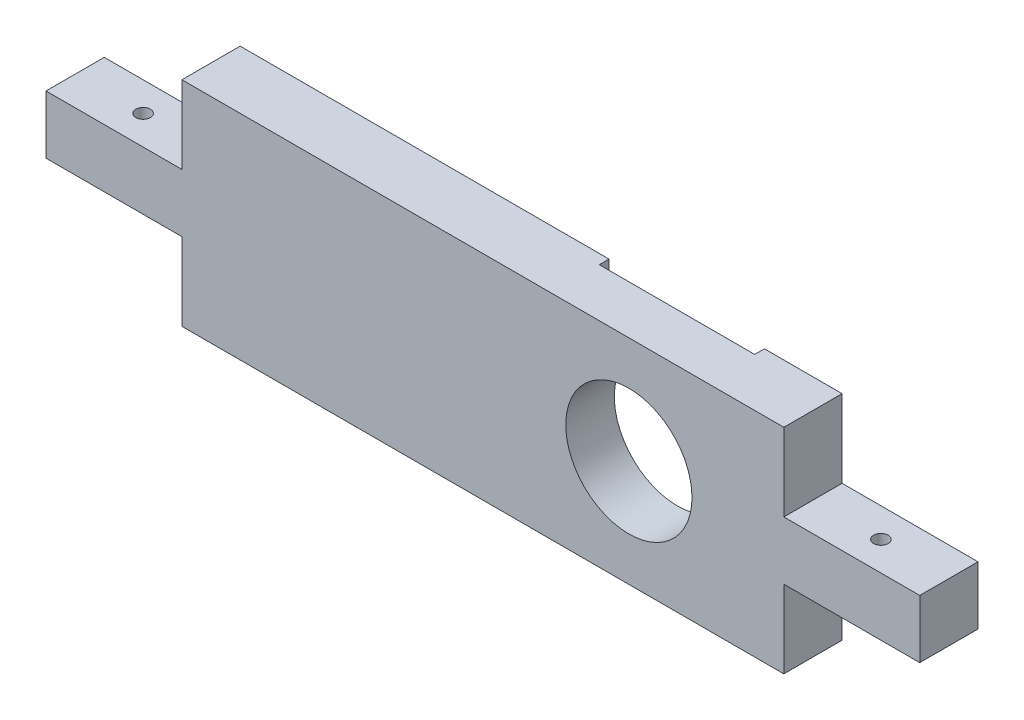
ISO-10303-21;
HEADER;
FILE_DESCRIPTION(('STEP AP214'),'2;1');
FILE_NAME('part.step','',(''),(''),'','','');
FILE_SCHEMA(('AUTOMOTIVE_DESIGN { 1 0 10303 214 1 1 1 1 }'));
ENDSEC;
DATA;
#1=APPLICATION_CONTEXT('core data for automotive mechanical design processes');
#2=APPLICATION_PROTOCOL_DEFINITION('international standard','automotive_design',2000,#1);
#3=PRODUCT_CONTEXT('',#1,'mechanical');
#4=PRODUCT('Part','Part','',(#3));
#5=PRODUCT_RELATED_PRODUCT_CATEGORY('part','',(#4));
#6=PRODUCT_DEFINITION_FORMATION('','',#4);
#7=PRODUCT_DEFINITION_CONTEXT('part definition',#1,'design');
#8=PRODUCT_DEFINITION('design','',#6,#7);
#9=PRODUCT_DEFINITION_SHAPE('','',#8);
#10=(LENGTH_UNIT() NAMED_UNIT(*) SI_UNIT(.MILLI.,.METRE.));
#11=(NAMED_UNIT(*) PLANE_ANGLE_UNIT() SI_UNIT($,.RADIAN.));
#12=(NAMED_UNIT(*) SI_UNIT($,.STERADIAN.) SOLID_ANGLE_UNIT());
#13=UNCERTAINTY_MEASURE_WITH_UNIT(LENGTH_MEASURE(1.E-05),#10,'distance_accuracy_value','');
#14=(GEOMETRIC_REPRESENTATION_CONTEXT(3) GLOBAL_UNCERTAINTY_ASSIGNED_CONTEXT((#13)) GLOBAL_UNIT_ASSIGNED_CONTEXT((#10,
#11,#12)) REPRESENTATION_CONTEXT('',''));
#15=CARTESIAN_POINT('',(0.,0.,0.));
#16=DIRECTION('',(0.,0.,1.));
#17=DIRECTION('',(1.,0.,0.));
#18=AXIS2_PLACEMENT_3D('',#15,#16,#17);
#19=CARTESIAN_POINT('',(0.,0.,0.));
#20=DIRECTION('',(0.,0.,-1.));
#21=DIRECTION('',(-1.,0.,0.));
#22=AXIS2_PLACEMENT_3D('',#19,#20,#21);
#23=PLANE('',#22);
#24=DIRECTION('',(0.,-1.,0.));
#25=VECTOR('',#24,1.);
#26=CARTESIAN_POINT('',(330.2,139.7,0.));
#27=LINE('',#26,#25);
#28=CARTESIAN_POINT('',(330.2,139.7,0.));
#29=VERTEX_POINT('',#28);
#30=CARTESIAN_POINT('',(330.2,0.,0.));
#31=VERTEX_POINT('',#30);
#32=EDGE_CURVE('E162',#29,#31,#27,.T.);
#33=ORIENTED_EDGE('',*,*,#32,.T.);
#34=DIRECTION('',(1.,0.,0.));
#35=VECTOR('',#34,1.);
#36=CARTESIAN_POINT('',(0.,0.,0.));
#37=LINE('',#36,#35);
#38=CARTESIAN_POINT('',(88.9,0.,0.));
#39=VERTEX_POINT('',#38);
#40=EDGE_CURVE('E191',#39,#31,#37,.T.);
#41=ORIENTED_EDGE('',*,*,#40,.F.);
#42=DIRECTION('',(0.,1.,0.));
#43=VECTOR('',#42,1.);
#44=CARTESIAN_POINT('',(88.9000000000001,50.8,0.));
#45=LINE('',#44,#43);
#46=CARTESIAN_POINT('',(88.9000000000001,50.8,0.));
#47=VERTEX_POINT('',#46);
#48=EDGE_CURVE('E262',#39,#47,#45,.T.);
#49=ORIENTED_EDGE('',*,*,#48,.T.);
#50=DIRECTION('',(-1.,0.,0.));
#51=VECTOR('',#50,1.);
#52=CARTESIAN_POINT('',(0.,50.8,0.));
#53=LINE('',#52,#51);
#54=CARTESIAN_POINT('',(0.,50.8,0.));
#55=VERTEX_POINT('',#54);
#56=EDGE_CURVE('E73',#47,#55,#53,.T.);
#57=ORIENTED_EDGE('',*,*,#56,.T.);
#58=DIRECTION('',(0.,-1.,0.));
#59=VECTOR('',#58,1.);
#60=CARTESIAN_POINT('',(0.,0.,0.));
#61=LINE('',#60,#59);
#62=CARTESIAN_POINT('',(0.,88.8999999999999,0.));
#63=VERTEX_POINT('',#62);
#64=EDGE_CURVE('E196',#63,#55,#61,.T.);
#65=ORIENTED_EDGE('',*,*,#64,.F.);
#66=DIRECTION('',(1.,0.,0.));
#67=VECTOR('',#66,1.);
#68=CARTESIAN_POINT('',(0.,88.8999999999999,0.));
#69=LINE('',#68,#67);
#70=CARTESIAN_POINT('',(88.9000000000001,88.8999999999999,0.));
#71=VERTEX_POINT('',#70);
#72=EDGE_CURVE('E213',#63,#71,#69,.T.);
#73=ORIENTED_EDGE('',*,*,#72,.T.);
#74=DIRECTION('',(0.,1.,0.));
#75=VECTOR('',#74,1.);
#76=CARTESIAN_POINT('',(88.9000000000001,88.8999999999999,0.));
#77=LINE('',#76,#75);
#78=CARTESIAN_POINT('',(88.9000000000001,139.7,0.));
#79=VERTEX_POINT('',#78);
#80=EDGE_CURVE('E186',#71,#79,#77,.T.);
#81=ORIENTED_EDGE('',*,*,#80,.T.);
#82=DIRECTION('',(-1.,0.,0.));
#83=VECTOR('',#82,1.);
#84=CARTESIAN_POINT('',(1.11022302462516E-13,139.7,0.));
#85=LINE('',#84,#83);
#86=EDGE_CURVE('E179',#29,#79,#85,.T.);
#87=ORIENTED_EDGE('',*,*,#86,.F.);
#88=EDGE_LOOP('',(#33,#41,#49,#57,#65,#73,#81,#87));
#89=FACE_BOUND('',#88,.T.);
#90=ADVANCED_FACE('F48',(#89),#23,.T.);
#91=CARTESIAN_POINT('',(0.,0.,38.1));
#92=DIRECTION('',(1.,0.,0.));
#93=DIRECTION('',(0.,1.,0.));
#94=AXIS2_PLACEMENT_3D('',#91,#92,#93);
#95=PLANE('',#94);
#96=ORIENTED_EDGE('',*,*,#64,.T.);
#97=DIRECTION('',(0.,0.,1.));
#98=VECTOR('',#97,1.);
#99=CARTESIAN_POINT('',(0.,50.8,0.));
#100=LINE('',#99,#98);
#101=CARTESIAN_POINT('',(0.,50.8,38.1));
#102=VERTEX_POINT('',#101);
#103=EDGE_CURVE('E258',#55,#102,#100,.T.);
#104=ORIENTED_EDGE('',*,*,#103,.T.);
#105=DIRECTION('',(0.,-1.,0.));
#106=VECTOR('',#105,1.);
#107=CARTESIAN_POINT('',(0.,0.,38.1));
#108=LINE('',#107,#106);
#109=CARTESIAN_POINT('',(0.,88.8999999999999,38.1));
#110=VERTEX_POINT('',#109);
#111=EDGE_CURVE('E190',#110,#102,#108,.T.);
#112=ORIENTED_EDGE('',*,*,#111,.F.);
#113=DIRECTION('',(0.,0.,1.));
#114=VECTOR('',#113,1.);
#115=CARTESIAN_POINT('',(0.,88.8999999999999,0.));
#116=LINE('',#115,#114);
#117=EDGE_CURVE('E205',#63,#110,#116,.T.);
#118=ORIENTED_EDGE('',*,*,#117,.F.);
#119=EDGE_LOOP('',(#96,#104,#112,#118));
#120=FACE_BOUND('',#119,.T.);
#121=ADVANCED_FACE('F50',(#120),#95,.F.);
#122=CARTESIAN_POINT('',(0.,0.,38.1));
#123=DIRECTION('',(0.,1.,0.));
#124=DIRECTION('',(0.,0.,1.));
#125=AXIS2_PLACEMENT_3D('',#122,#123,#124);
#126=PLANE('',#125);
#127=ORIENTED_EDGE('',*,*,#40,.T.);
#128=DIRECTION('',(0.,0.,-1.));
#129=VECTOR('',#128,1.);
#130=CARTESIAN_POINT('',(330.2,0.,0.));
#131=LINE('',#130,#129);
#132=CARTESIAN_POINT('',(330.2,0.,6.35));
#133=VERTEX_POINT('',#132);
#134=EDGE_CURVE('E168',#133,#31,#131,.T.);
#135=ORIENTED_EDGE('',*,*,#134,.F.);
#136=DIRECTION('',(-1.,0.,0.));
#137=VECTOR('',#136,1.);
#138=CARTESIAN_POINT('',(330.2,0.,6.35));
#139=LINE('',#138,#137);
#140=CARTESIAN_POINT('',(431.8,0.,6.35000000000001));
#141=VERTEX_POINT('',#140);
#142=EDGE_CURVE('E182',#141,#133,#139,.T.);
#143=ORIENTED_EDGE('',*,*,#142,.F.);
#144=DIRECTION('',(0.,0.,1.));
#145=VECTOR('',#144,1.);
#146=CARTESIAN_POINT('',(431.8,0.,0.));
#147=LINE('',#146,#145);
#148=CARTESIAN_POINT('',(431.8,0.,0.));
#149=VERTEX_POINT('',#148);
#150=EDGE_CURVE('E295',#149,#141,#147,.T.);
#151=ORIENTED_EDGE('',*,*,#150,.F.);
#152=CARTESIAN_POINT('',(482.6,0.,0.));
#153=VERTEX_POINT('',#152);
#154=EDGE_CURVE('E195',#149,#153,#37,.T.);
#155=ORIENTED_EDGE('',*,*,#154,.T.);
#156=DIRECTION('',(0.,0.,1.));
#157=VECTOR('',#156,1.);
#158=CARTESIAN_POINT('',(482.6,0.,0.));
#159=LINE('',#158,#157);
#160=CARTESIAN_POINT('',(482.6,0.,38.1));
#161=VERTEX_POINT('',#160);
#162=EDGE_CURVE('E234',#153,#161,#159,.T.);
#163=ORIENTED_EDGE('',*,*,#162,.T.);
#164=DIRECTION('',(1.,0.,0.));
#165=VECTOR('',#164,1.);
#166=CARTESIAN_POINT('',(0.,0.,38.1));
#167=LINE('',#166,#165);
#168=CARTESIAN_POINT('',(88.9,0.,38.1));
#169=VERTEX_POINT('',#168);
#170=EDGE_CURVE('E201',#169,#161,#167,.T.);
#171=ORIENTED_EDGE('',*,*,#170,.F.);
#172=DIRECTION('',(0.,0.,1.));
#173=VECTOR('',#172,1.);
#174=CARTESIAN_POINT('',(88.9,0.,0.));
#175=LINE('',#174,#173);
#176=EDGE_CURVE('E261',#39,#169,#175,.T.);
#177=ORIENTED_EDGE('',*,*,#176,.F.);
#178=EDGE_LOOP('',(#127,#135,#143,#151,#155,#163,#171,#177));
#179=FACE_BOUND('',#178,.T.);
#180=ADVANCED_FACE('F310',(#179),#126,.F.);
#181=CARTESIAN_POINT('',(571.5,0.,38.1));
#182=DIRECTION('',(-1.,0.,0.));
#183=DIRECTION('',(0.,0.,1.));
#184=AXIS2_PLACEMENT_3D('',#181,#182,#183);
#185=PLANE('',#184);
#186=DIRECTION('',(0.,1.,0.));
#187=VECTOR('',#186,1.);
#188=CARTESIAN_POINT('',(571.5,0.,38.1));
#189=LINE('',#188,#187);
#190=CARTESIAN_POINT('',(571.5,50.8000000000001,38.1));
#191=VERTEX_POINT('',#190);
#192=CARTESIAN_POINT('',(571.5,88.9000000000001,38.1));
#193=VERTEX_POINT('',#192);
#194=EDGE_CURVE('E57',#191,#193,#189,.T.);
#195=ORIENTED_EDGE('',*,*,#194,.F.);
#196=DIRECTION('',(0.,0.,1.));
#197=VECTOR('',#196,1.);
#198=CARTESIAN_POINT('',(571.5,50.8000000000001,0.));
#199=LINE('',#198,#197);
#200=CARTESIAN_POINT('',(571.5,50.8000000000001,0.));
#201=VERTEX_POINT('',#200);
#202=EDGE_CURVE('E239',#201,#191,#199,.T.);
#203=ORIENTED_EDGE('',*,*,#202,.F.);
#204=DIRECTION('',(0.,1.,0.));
#205=VECTOR('',#204,1.);
#206=CARTESIAN_POINT('',(571.5,0.,0.));
#207=LINE('',#206,#205);
#208=CARTESIAN_POINT('',(571.5,88.9000000000001,0.));
#209=VERTEX_POINT('',#208);
#210=EDGE_CURVE('E188',#201,#209,#207,.T.);
#211=ORIENTED_EDGE('',*,*,#210,.T.);
#212=DIRECTION('',(0.,0.,1.));
#213=VECTOR('',#212,1.);
#214=CARTESIAN_POINT('',(571.5,88.9000000000001,0.));
#215=LINE('',#214,#213);
#216=EDGE_CURVE('E217',#209,#193,#215,.T.);
#217=ORIENTED_EDGE('',*,*,#216,.T.);
#218=EDGE_LOOP('',(#195,#203,#211,#217));
#219=FACE_BOUND('',#218,.T.);
#220=ADVANCED_FACE('F356',(#219),#185,.F.);
#221=CARTESIAN_POINT('',(1.11022302462516E-13,139.7,38.1));
#222=DIRECTION('',(0.,-1.,0.));
#223=DIRECTION('',(0.,0.,-1.));
#224=AXIS2_PLACEMENT_3D('',#221,#222,#223);
#225=PLANE('',#224);
#226=DIRECTION('',(-1.,0.,0.));
#227=VECTOR('',#226,1.);
#228=CARTESIAN_POINT('',(330.2,139.7,6.35));
#229=LINE('',#228,#227);
#230=CARTESIAN_POINT('',(431.8,139.7,6.35000000000001));
#231=VERTEX_POINT('',#230);
#232=CARTESIAN_POINT('',(330.2,139.7,6.35));
#233=VERTEX_POINT('',#232);
#234=EDGE_CURVE('E174',#231,#233,#229,.T.);
#235=ORIENTED_EDGE('',*,*,#234,.T.);
#236=DIRECTION('',(0.,0.,-1.));
#237=VECTOR('',#236,1.);
#238=CARTESIAN_POINT('',(330.2,139.7,0.));
#239=LINE('',#238,#237);
#240=EDGE_CURVE('E165',#233,#29,#239,.T.);
#241=ORIENTED_EDGE('',*,*,#240,.T.);
#242=ORIENTED_EDGE('',*,*,#86,.T.);
#243=DIRECTION('',(0.,0.,1.));
#244=VECTOR('',#243,1.);
#245=CARTESIAN_POINT('',(88.9000000000001,139.7,0.));
#246=LINE('',#245,#244);
#247=CARTESIAN_POINT('',(88.9000000000001,139.7,38.1));
#248=VERTEX_POINT('',#247);
#249=EDGE_CURVE('E198',#79,#248,#246,.T.);
#250=ORIENTED_EDGE('',*,*,#249,.T.);
#251=DIRECTION('',(-1.,0.,0.));
#252=VECTOR('',#251,1.);
#253=CARTESIAN_POINT('',(1.11022302462516E-13,139.7,38.1));
#254=LINE('',#253,#252);
#255=CARTESIAN_POINT('',(482.6,139.7,38.1));
#256=VERTEX_POINT('',#255);
#257=EDGE_CURVE('E13',#256,#248,#254,.T.);
#258=ORIENTED_EDGE('',*,*,#257,.F.);
#259=DIRECTION('',(0.,0.,1.));
#260=VECTOR('',#259,1.);
#261=CARTESIAN_POINT('',(482.6,139.7,0.));
#262=LINE('',#261,#260);
#263=CARTESIAN_POINT('',(482.6,139.7,0.));
#264=VERTEX_POINT('',#263);
#265=EDGE_CURVE('E220',#264,#256,#262,.T.);
#266=ORIENTED_EDGE('',*,*,#265,.F.);
#267=CARTESIAN_POINT('',(431.8,139.7,0.));
#268=VERTEX_POINT('',#267);
#269=EDGE_CURVE('E187',#264,#268,#85,.T.);
#270=ORIENTED_EDGE('',*,*,#269,.T.);
#271=DIRECTION('',(0.,0.,1.));
#272=VECTOR('',#271,1.);
#273=CARTESIAN_POINT('',(431.8,139.7,0.));
#274=LINE('',#273,#272);
#275=EDGE_CURVE('E65',#268,#231,#274,.T.);
#276=ORIENTED_EDGE('',*,*,#275,.T.);
#277=EDGE_LOOP('',(#235,#241,#242,#250,#258,#266,#270,#276));
#278=FACE_BOUND('',#277,.T.);
#279=ADVANCED_FACE('F177',(#278),#225,.F.);
#280=CARTESIAN_POINT('',(0.,0.,38.1));
#281=DIRECTION('',(0.,0.,-1.));
#282=DIRECTION('',(-1.,0.,0.));
#283=AXIS2_PLACEMENT_3D('',#280,#281,#282);
#284=PLANE('',#283);
#285=CARTESIAN_POINT('',(381.247583626148,69.8500000000001,38.1));
#286=DIRECTION('',(0.,0.,1.));
#287=DIRECTION('',(1.,0.,0.));
#288=AXIS2_PLACEMENT_3D('',#285,#286,#287);
#289=CIRCLE('',#288,41.275);
#290=CARTESIAN_POINT('',(422.522583626148,69.8500000000001,38.1));
#291=VERTEX_POINT('',#290);
#292=EDGE_CURVE('E270',#291,#291,#289,.T.);
#293=ORIENTED_EDGE('',*,*,#292,.F.);
#294=EDGE_LOOP('',(#293));
#295=FACE_BOUND('',#294,.T.);
#296=ORIENTED_EDGE('',*,*,#111,.T.);
#297=DIRECTION('',(-1.,0.,0.));
#298=VECTOR('',#297,1.);
#299=CARTESIAN_POINT('',(0.,50.8,38.1));
#300=LINE('',#299,#298);
#301=CARTESIAN_POINT('',(88.9000000000001,50.8,38.1));
#302=VERTEX_POINT('',#301);
#303=EDGE_CURVE('E268',#302,#102,#300,.T.);
#304=ORIENTED_EDGE('',*,*,#303,.F.);
#305=DIRECTION('',(0.,1.,0.));
#306=VECTOR('',#305,1.);
#307=CARTESIAN_POINT('',(88.9000000000001,50.8,38.1));
#308=LINE('',#307,#306);
#309=EDGE_CURVE('E265',#169,#302,#308,.T.);
#310=ORIENTED_EDGE('',*,*,#309,.F.);
#311=ORIENTED_EDGE('',*,*,#170,.T.);
#312=DIRECTION('',(0.,-1.,0.));
#313=VECTOR('',#312,1.);
#314=CARTESIAN_POINT('',(482.6,50.8,38.1));
#315=LINE('',#314,#313);
#316=CARTESIAN_POINT('',(482.6,50.8,38.1));
#317=VERTEX_POINT('',#316);
#318=EDGE_CURVE('E246',#317,#161,#315,.T.);
#319=ORIENTED_EDGE('',*,*,#318,.F.);
#320=DIRECTION('',(-1.,0.,0.));
#321=VECTOR('',#320,1.);
#322=CARTESIAN_POINT('',(571.5,50.8000000000001,38.1));
#323=LINE('',#322,#321);
#324=EDGE_CURVE('E250',#191,#317,#323,.T.);
#325=ORIENTED_EDGE('',*,*,#324,.F.);
#326=ORIENTED_EDGE('',*,*,#194,.T.);
#327=DIRECTION('',(1.,0.,0.));
#328=VECTOR('',#327,1.);
#329=CARTESIAN_POINT('',(571.5,88.9000000000001,38.1));
#330=LINE('',#329,#328);
#331=CARTESIAN_POINT('',(482.6,88.9,38.1));
#332=VERTEX_POINT('',#331);
#333=EDGE_CURVE('E227',#332,#193,#330,.T.);
#334=ORIENTED_EDGE('',*,*,#333,.F.);
#335=DIRECTION('',(0.,-1.,0.));
#336=VECTOR('',#335,1.);
#337=CARTESIAN_POINT('',(482.6,88.9,38.1));
#338=LINE('',#337,#336);
#339=EDGE_CURVE('E231',#256,#332,#338,.T.);
#340=ORIENTED_EDGE('',*,*,#339,.F.);
#341=ORIENTED_EDGE('',*,*,#257,.T.);
#342=DIRECTION('',(0.,1.,0.));
#343=VECTOR('',#342,1.);
#344=CARTESIAN_POINT('',(88.9000000000001,88.8999999999999,38.1));
#345=LINE('',#344,#343);
#346=CARTESIAN_POINT('',(88.9000000000001,88.8999999999999,38.1));
#347=VERTEX_POINT('',#346);
#348=EDGE_CURVE('E210',#347,#248,#345,.T.);
#349=ORIENTED_EDGE('',*,*,#348,.F.);
#350=DIRECTION('',(1.,0.,0.));
#351=VECTOR('',#350,1.);
#352=CARTESIAN_POINT('',(0.,88.8999999999999,38.1));
#353=LINE('',#352,#351);
#354=EDGE_CURVE('E214',#110,#347,#353,.T.);
#355=ORIENTED_EDGE('',*,*,#354,.F.);
#356=EDGE_LOOP('',(#296,#304,#310,#311,#319,#325,#326,#334,#340,#341,#349,#355));
#357=FACE_BOUND('',#356,.T.);
#358=ADVANCED_FACE('F329',(#295,#357),#284,.F.);
#359=DIRECTION('',(0.,-1.,0.));
#360=VECTOR('',#359,1.);
#361=CARTESIAN_POINT('',(431.8,139.7,0.));
#362=LINE('',#361,#360);
#363=EDGE_CURVE('E173',#268,#149,#362,.T.);
#364=ORIENTED_EDGE('',*,*,#363,.F.);
#365=ORIENTED_EDGE('',*,*,#269,.F.);
#366=DIRECTION('',(0.,-1.,0.));
#367=VECTOR('',#366,1.);
#368=CARTESIAN_POINT('',(482.6,88.9,0.));
#369=LINE('',#368,#367);
#370=CARTESIAN_POINT('',(482.6,88.9,0.));
#371=VERTEX_POINT('',#370);
#372=EDGE_CURVE('E230',#264,#371,#369,.T.);
#373=ORIENTED_EDGE('',*,*,#372,.T.);
#374=DIRECTION('',(1.,0.,0.));
#375=VECTOR('',#374,1.);
#376=CARTESIAN_POINT('',(571.5,88.9000000000001,0.));
#377=LINE('',#376,#375);
#378=EDGE_CURVE('E223',#371,#209,#377,.T.);
#379=ORIENTED_EDGE('',*,*,#378,.T.);
#380=ORIENTED_EDGE('',*,*,#210,.F.);
#381=DIRECTION('',(-1.,0.,0.));
#382=VECTOR('',#381,1.);
#383=CARTESIAN_POINT('',(571.5,50.8000000000001,0.));
#384=LINE('',#383,#382);
#385=CARTESIAN_POINT('',(482.6,50.8,0.));
#386=VERTEX_POINT('',#385);
#387=EDGE_CURVE('E249',#201,#386,#384,.T.);
#388=ORIENTED_EDGE('',*,*,#387,.T.);
#389=DIRECTION('',(0.,-1.,0.));
#390=VECTOR('',#389,1.);
#391=CARTESIAN_POINT('',(482.6,50.8,0.));
#392=LINE('',#391,#390);
#393=EDGE_CURVE('E242',#386,#153,#392,.T.);
#394=ORIENTED_EDGE('',*,*,#393,.T.);
#395=ORIENTED_EDGE('',*,*,#154,.F.);
#396=EDGE_LOOP('',(#364,#365,#373,#379,#380,#388,#394,#395));
#397=FACE_BOUND('',#396,.T.);
#398=ADVANCED_FACE('F304',(#397),#23,.T.);
#399=CARTESIAN_POINT('',(88.9000000000001,88.8999999999999,0.));
#400=DIRECTION('',(1.,0.,0.));
#401=DIRECTION('',(0.,0.,-1.));
#402=AXIS2_PLACEMENT_3D('',#399,#400,#401);
#403=PLANE('',#402);
#404=ORIENTED_EDGE('',*,*,#348,.T.);
#405=ORIENTED_EDGE('',*,*,#249,.F.);
#406=ORIENTED_EDGE('',*,*,#80,.F.);
#407=DIRECTION('',(0.,0.,1.));
#408=VECTOR('',#407,1.);
#409=CARTESIAN_POINT('',(88.9000000000001,88.8999999999999,0.));
#410=LINE('',#409,#408);
#411=EDGE_CURVE('E207',#71,#347,#410,.T.);
#412=ORIENTED_EDGE('',*,*,#411,.T.);
#413=EDGE_LOOP('',(#404,#405,#406,#412));
#414=FACE_BOUND('',#413,.T.);
#415=ADVANCED_FACE('F365',(#414),#403,.F.);
#416=CARTESIAN_POINT('',(0.,88.8999999999999,0.));
#417=DIRECTION('',(0.,-1.,0.));
#418=DIRECTION('',(0.,0.,-1.));
#419=AXIS2_PLACEMENT_3D('',#416,#417,#418);
#420=PLANE('',#419);
#421=CARTESIAN_POINT('',(44.45,88.8999999999999,19.05));
#422=DIRECTION('',(0.,-1.,0.));
#423=DIRECTION('',(0.,0.,-1.));
#424=AXIS2_PLACEMENT_3D('',#421,#422,#423);
#425=CIRCLE('',#424,4.7625);
#426=CARTESIAN_POINT('',(49.2125,88.8999999999999,19.05));
#427=VERTEX_POINT('',#426);
#428=EDGE_CURVE('E276',#427,#427,#425,.T.);
#429=ORIENTED_EDGE('',*,*,#428,.T.);
#430=EDGE_LOOP('',(#429));
#431=FACE_BOUND('',#430,.T.);
#432=ORIENTED_EDGE('',*,*,#354,.T.);
#433=ORIENTED_EDGE('',*,*,#411,.F.);
#434=ORIENTED_EDGE('',*,*,#72,.F.);
#435=ORIENTED_EDGE('',*,*,#117,.T.);
#436=EDGE_LOOP('',(#432,#433,#434,#435));
#437=FACE_BOUND('',#436,.T.);
#438=ADVANCED_FACE('F368',(#431,#437),#420,.F.);
#439=CARTESIAN_POINT('',(571.5,88.9000000000001,0.));
#440=DIRECTION('',(0.,-1.,0.));
#441=DIRECTION('',(1.,0.,0.));
#442=AXIS2_PLACEMENT_3D('',#439,#440,#441);
#443=PLANE('',#442);
#444=CARTESIAN_POINT('',(527.05,88.9,19.05));
#445=DIRECTION('',(0.,-1.,0.));
#446=DIRECTION('',(1.,0.,0.));
#447=AXIS2_PLACEMENT_3D('',#444,#445,#446);
#448=CIRCLE('',#447,4.76250000000001);
#449=CARTESIAN_POINT('',(531.8125,88.9,19.05));
#450=VERTEX_POINT('',#449);
#451=EDGE_CURVE('E282',#450,#450,#448,.T.);
#452=ORIENTED_EDGE('',*,*,#451,.T.);
#453=EDGE_LOOP('',(#452));
#454=FACE_BOUND('',#453,.T.);
#455=ORIENTED_EDGE('',*,*,#333,.T.);
#456=ORIENTED_EDGE('',*,*,#216,.F.);
#457=ORIENTED_EDGE('',*,*,#378,.F.);
#458=DIRECTION('',(0.,0.,1.));
#459=VECTOR('',#458,1.);
#460=CARTESIAN_POINT('',(482.6,88.9,0.));
#461=LINE('',#460,#459);
#462=EDGE_CURVE('E222',#371,#332,#461,.T.);
#463=ORIENTED_EDGE('',*,*,#462,.T.);
#464=EDGE_LOOP('',(#455,#456,#457,#463));
#465=FACE_BOUND('',#464,.T.);
#466=ADVANCED_FACE('F360',(#454,#465),#443,.F.);
#467=CARTESIAN_POINT('',(482.6,88.9,0.));
#468=DIRECTION('',(-1.,0.,0.));
#469=DIRECTION('',(0.,0.,1.));
#470=AXIS2_PLACEMENT_3D('',#467,#468,#469);
#471=PLANE('',#470);
#472=ORIENTED_EDGE('',*,*,#339,.T.);
#473=ORIENTED_EDGE('',*,*,#462,.F.);
#474=ORIENTED_EDGE('',*,*,#372,.F.);
#475=ORIENTED_EDGE('',*,*,#265,.T.);
#476=EDGE_LOOP('',(#472,#473,#474,#475));
#477=FACE_BOUND('',#476,.T.);
#478=ADVANCED_FACE('F376',(#477),#471,.F.);
#479=CARTESIAN_POINT('',(482.6,50.8,0.));
#480=DIRECTION('',(-1.,0.,0.));
#481=DIRECTION('',(0.,0.,1.));
#482=AXIS2_PLACEMENT_3D('',#479,#480,#481);
#483=PLANE('',#482);
#484=ORIENTED_EDGE('',*,*,#318,.T.);
#485=ORIENTED_EDGE('',*,*,#162,.F.);
#486=ORIENTED_EDGE('',*,*,#393,.F.);
#487=DIRECTION('',(0.,0.,1.));
#488=VECTOR('',#487,1.);
#489=CARTESIAN_POINT('',(482.6,50.8,0.));
#490=LINE('',#489,#488);
#491=EDGE_CURVE('E241',#386,#317,#490,.T.);
#492=ORIENTED_EDGE('',*,*,#491,.T.);
#493=EDGE_LOOP('',(#484,#485,#486,#492));
#494=FACE_BOUND('',#493,.T.);
#495=ADVANCED_FACE('F348',(#494),#483,.F.);
#496=CARTESIAN_POINT('',(571.5,50.8000000000001,0.));
#497=DIRECTION('',(0.,1.,0.));
#498=DIRECTION('',(-1.,0.,0.));
#499=AXIS2_PLACEMENT_3D('',#496,#497,#498);
#500=PLANE('',#499);
#501=CARTESIAN_POINT('',(527.05,50.7999999999998,19.05));
#502=DIRECTION('',(0.,-1.,0.));
#503=DIRECTION('',(1.,0.,0.));
#504=AXIS2_PLACEMENT_3D('',#501,#502,#503);
#505=CIRCLE('',#504,4.76250000000001);
#506=CARTESIAN_POINT('',(531.8125,50.7999999999998,19.05));
#507=VERTEX_POINT('',#506);
#508=EDGE_CURVE('E285',#507,#507,#505,.T.);
#509=ORIENTED_EDGE('',*,*,#508,.F.);
#510=EDGE_LOOP('',(#509));
#511=FACE_BOUND('',#510,.T.);
#512=ORIENTED_EDGE('',*,*,#324,.T.);
#513=ORIENTED_EDGE('',*,*,#491,.F.);
#514=ORIENTED_EDGE('',*,*,#387,.F.);
#515=ORIENTED_EDGE('',*,*,#202,.T.);
#516=EDGE_LOOP('',(#512,#513,#514,#515));
#517=FACE_BOUND('',#516,.T.);
#518=ADVANCED_FACE('F351',(#511,#517),#500,.F.);
#519=CARTESIAN_POINT('',(0.,50.8,0.));
#520=DIRECTION('',(0.,1.,0.));
#521=DIRECTION('',(-1.,0.,0.));
#522=AXIS2_PLACEMENT_3D('',#519,#520,#521);
#523=PLANE('',#522);
#524=CARTESIAN_POINT('',(44.45,50.8,19.05));
#525=DIRECTION('',(0.,-1.,0.));
#526=DIRECTION('',(1.,0.,0.));
#527=AXIS2_PLACEMENT_3D('',#524,#525,#526);
#528=CIRCLE('',#527,4.7625);
#529=CARTESIAN_POINT('',(49.2125,50.8,19.05));
#530=VERTEX_POINT('',#529);
#531=EDGE_CURVE('E279',#530,#530,#528,.T.);
#532=ORIENTED_EDGE('',*,*,#531,.F.);
#533=EDGE_LOOP('',(#532));
#534=FACE_BOUND('',#533,.T.);
#535=ORIENTED_EDGE('',*,*,#303,.T.);
#536=ORIENTED_EDGE('',*,*,#103,.F.);
#537=ORIENTED_EDGE('',*,*,#56,.F.);
#538=DIRECTION('',(0.,0.,1.));
#539=VECTOR('',#538,1.);
#540=CARTESIAN_POINT('',(88.9000000000001,50.8,0.));
#541=LINE('',#540,#539);
#542=EDGE_CURVE('E253',#47,#302,#541,.T.);
#543=ORIENTED_EDGE('',*,*,#542,.T.);
#544=EDGE_LOOP('',(#535,#536,#537,#543));
#545=FACE_BOUND('',#544,.T.);
#546=ADVANCED_FACE('F341',(#534,#545),#523,.F.);
#547=CARTESIAN_POINT('',(88.9000000000001,50.8,0.));
#548=DIRECTION('',(1.,0.,0.));
#549=DIRECTION('',(0.,1.,0.));
#550=AXIS2_PLACEMENT_3D('',#547,#548,#549);
#551=PLANE('',#550);
#552=ORIENTED_EDGE('',*,*,#309,.T.);
#553=ORIENTED_EDGE('',*,*,#542,.F.);
#554=ORIENTED_EDGE('',*,*,#48,.F.);
#555=ORIENTED_EDGE('',*,*,#176,.T.);
#556=EDGE_LOOP('',(#552,#553,#554,#555));
#557=FACE_BOUND('',#556,.T.);
#558=ADVANCED_FACE('F325',(#557),#551,.F.);
#559=CARTESIAN_POINT('',(381.247583626148,69.8500000000001,0.));
#560=DIRECTION('',(0.,0.,1.));
#561=DIRECTION('',(1.,0.,0.));
#562=AXIS2_PLACEMENT_3D('',#559,#560,#561);
#563=CYLINDRICAL_SURFACE('',#562,41.275);
#564=CARTESIAN_POINT('',(381.247583626148,69.8500000000001,6.35000000000001));
#565=DIRECTION('',(0.,0.,1.));
#566=DIRECTION('',(1.,0.,0.));
#567=AXIS2_PLACEMENT_3D('',#564,#565,#566);
#568=CIRCLE('',#567,41.275);
#569=CARTESIAN_POINT('',(422.522583626148,69.8500000000001,6.35000000000001));
#570=VERTEX_POINT('',#569);
#571=EDGE_CURVE('E52',#570,#570,#568,.F.);
#572=CARTESIAN_POINT('',(422.522583626148,69.8500000000001,6.35000000000001));
#573=CARTESIAN_POINT('',(422.522583626148,69.8500000000001,6.68072916666668));
#574=CARTESIAN_POINT('',(422.522583626148,69.8500000000001,7.01145833333334));
#575=CARTESIAN_POINT('',(422.522583626148,69.8500000000001,7.67291666666668));
#576=CARTESIAN_POINT('',(422.522583626148,69.8500000000001,8.00364583333334));
#577=CARTESIAN_POINT('',(422.522583626148,69.8500000000001,8.66510416666668));
#578=CARTESIAN_POINT('',(422.522583626148,69.8500000000001,8.99583333333334));
#579=CARTESIAN_POINT('',(422.522583626148,69.8500000000001,9.65729166666668));
#580=CARTESIAN_POINT('',(422.522583626148,69.8500000000001,9.98802083333334));
#581=CARTESIAN_POINT('',(422.522583626148,69.8500000000001,10.6494791666667));
#582=CARTESIAN_POINT('',(422.522583626148,69.8500000000001,10.9802083333333));
#583=CARTESIAN_POINT('',(422.522583626148,69.8500000000001,11.6416666666667));
#584=CARTESIAN_POINT('',(422.522583626148,69.8500000000001,11.9723958333333));
#585=CARTESIAN_POINT('',(422.522583626148,69.8500000000001,12.6338541666667));
#586=CARTESIAN_POINT('',(422.522583626148,69.8500000000001,12.9645833333333));
#587=CARTESIAN_POINT('',(422.522583626148,69.8500000000001,13.6260416666667));
#588=CARTESIAN_POINT('',(422.522583626148,69.8500000000001,13.9567708333333));
#589=CARTESIAN_POINT('',(422.522583626148,69.8500000000001,14.6182291666667));
#590=CARTESIAN_POINT('',(422.522583626148,69.8500000000001,14.9489583333333));
#591=CARTESIAN_POINT('',(422.522583626148,69.8500000000001,15.6104166666667));
#592=CARTESIAN_POINT('',(422.522583626148,69.8500000000001,15.9411458333333));
#593=CARTESIAN_POINT('',(422.522583626148,69.8500000000001,16.6026041666667));
#594=CARTESIAN_POINT('',(422.522583626148,69.8500000000001,16.9333333333333));
#595=CARTESIAN_POINT('',(422.522583626148,69.8500000000001,17.5947916666667));
#596=CARTESIAN_POINT('',(422.522583626148,69.8500000000001,17.9255208333333));
#597=CARTESIAN_POINT('',(422.522583626148,69.8500000000001,18.5869791666667));
#598=CARTESIAN_POINT('',(422.522583626148,69.8500000000001,18.9177083333333));
#599=CARTESIAN_POINT('',(422.522583626148,69.8500000000001,19.5791666666667));
#600=CARTESIAN_POINT('',(422.522583626148,69.8500000000001,19.9098958333333));
#601=CARTESIAN_POINT('',(422.522583626148,69.8500000000001,20.5713541666667));
#602=CARTESIAN_POINT('',(422.522583626148,69.8500000000001,20.9020833333333));
#603=CARTESIAN_POINT('',(422.522583626148,69.8500000000001,21.5635416666667));
#604=CARTESIAN_POINT('',(422.522583626148,69.8500000000001,21.8942708333333));
#605=CARTESIAN_POINT('',(422.522583626148,69.8500000000001,22.5557291666667));
#606=CARTESIAN_POINT('',(422.522583626148,69.8500000000001,22.8864583333333));
#607=CARTESIAN_POINT('',(422.522583626148,69.8500000000001,23.5479166666667));
#608=CARTESIAN_POINT('',(422.522583626148,69.8500000000001,23.8786458333333));
#609=CARTESIAN_POINT('',(422.522583626148,69.8500000000001,24.5401041666667));
#610=CARTESIAN_POINT('',(422.522583626148,69.8500000000001,24.8708333333333));
#611=CARTESIAN_POINT('',(422.522583626148,69.8500000000001,25.5322916666667));
#612=CARTESIAN_POINT('',(422.522583626148,69.8500000000001,25.8630208333333));
#613=CARTESIAN_POINT('',(422.522583626148,69.8500000000001,26.5244791666667));
#614=CARTESIAN_POINT('',(422.522583626148,69.8500000000001,26.8552083333333));
#615=CARTESIAN_POINT('',(422.522583626148,69.8500000000001,27.5166666666667));
#616=CARTESIAN_POINT('',(422.522583626148,69.8500000000001,27.8473958333333));
#617=CARTESIAN_POINT('',(422.522583626148,69.8500000000001,28.5088541666667));
#618=CARTESIAN_POINT('',(422.522583626148,69.8500000000001,28.8395833333333));
#619=CARTESIAN_POINT('',(422.522583626148,69.8500000000001,29.5010416666667));
#620=CARTESIAN_POINT('',(422.522583626148,69.8500000000001,29.8317708333333));
#621=CARTESIAN_POINT('',(422.522583626148,69.8500000000001,30.4932291666667));
#622=CARTESIAN_POINT('',(422.522583626148,69.8500000000001,30.8239583333333));
#623=CARTESIAN_POINT('',(422.522583626148,69.8500000000001,31.4854166666667));
#624=CARTESIAN_POINT('',(422.522583626148,69.8500000000001,31.8161458333333));
#625=CARTESIAN_POINT('',(422.522583626148,69.8500000000001,32.4776041666667));
#626=CARTESIAN_POINT('',(422.522583626148,69.8500000000001,32.8083333333333));
#627=CARTESIAN_POINT('',(422.522583626148,69.8500000000001,33.4697916666667));
#628=CARTESIAN_POINT('',(422.522583626148,69.8500000000001,33.8005208333333));
#629=CARTESIAN_POINT('',(422.522583626148,69.8500000000001,34.4619791666667));
#630=CARTESIAN_POINT('',(422.522583626148,69.8500000000001,34.7927083333333));
#631=CARTESIAN_POINT('',(422.522583626148,69.8500000000001,35.4541666666667));
#632=CARTESIAN_POINT('',(422.522583626148,69.8500000000001,35.7848958333333));
#633=CARTESIAN_POINT('',(422.522583626148,69.8500000000001,36.4463541666667));
#634=CARTESIAN_POINT('',(422.522583626148,69.8500000000001,36.7770833333333));
#635=CARTESIAN_POINT('',(422.522583626148,69.8500000000001,37.4385416666667));
#636=CARTESIAN_POINT('',(422.522583626148,69.8500000000001,37.7692708333333));
#637=CARTESIAN_POINT('',(422.522583626148,69.8500000000001,38.1));
#638=B_SPLINE_CURVE_WITH_KNOTS('',3,(#572,#573,#574,#575,#576,#577,#578,#579,#580,#581,#582,
#583,#584,#585,#586,#587,#588,#589,#590,#591,#592,#593,#594,#595,#596,#597,#598,#599,#600,#601,
#602,#603,#604,#605,#606,#607,#608,#609,#610,#611,#612,#613,#614,#615,#616,#617,#618,#619,#620,
#621,#622,#623,#624,#625,#626,#627,#628,#629,#630,#631,#632,#633,#634,#635,#636,#637),
.UNSPECIFIED.,.F.,.F.,(4,2,2,2,2,2,2,2,2,2,2,2,2,2,2,2,2,2,2,2,2,2,2,2,2,2,2,2,2,2,2,2,4),(0.,
0.9921875,1.984375,2.9765625,3.96875,4.9609375,5.953125,6.9453125,7.9375,8.9296875,9.921875,
10.9140625,11.90625,12.8984375,13.890625,14.8828125,15.875,16.8671875,17.859375,18.8515625,
19.84375,20.8359375,21.828125,22.8203125,23.8125,24.8046875,25.796875,26.7890625,27.78125,
28.7734375,29.765625,30.7578125,31.75),.UNSPECIFIED.);
#639=EDGE_CURVE('BSEAM321',#570,#291,#638,.T.);
#640=ORIENTED_EDGE('',*,*,#571,.T.);
#641=ORIENTED_EDGE('',*,*,#292,.T.);
#642=ORIENTED_EDGE('',*,*,#639,.T.);
#643=ORIENTED_EDGE('',*,*,#639,.F.);
#644=EDGE_LOOP('',(#640,#642,#641,#643));
#645=FACE_BOUND('',#644,.T.);
#646=ADVANCED_FACE('F321',(#645),#563,.F.);
#647=CARTESIAN_POINT('',(44.4499999999999,139.7,19.05));
#648=DIRECTION('',(0.,-1.,0.));
#649=DIRECTION('',(1.,0.,0.));
#650=AXIS2_PLACEMENT_3D('',#647,#648,#649);
#651=CYLINDRICAL_SURFACE('',#650,4.7625);
#652=CARTESIAN_POINT('',(49.2125,50.8,19.05));
#653=CARTESIAN_POINT('',(49.2125,51.196875,19.05));
#654=CARTESIAN_POINT('',(49.2125,51.59375,19.05));
#655=CARTESIAN_POINT('',(49.2125,52.3875,19.05));
#656=CARTESIAN_POINT('',(49.2125,52.784375,19.05));
#657=CARTESIAN_POINT('',(49.2125,53.578125,19.05));
#658=CARTESIAN_POINT('',(49.2125,53.975,19.05));
#659=CARTESIAN_POINT('',(49.2125,54.76875,19.05));
#660=CARTESIAN_POINT('',(49.2125,55.165625,19.05));
#661=CARTESIAN_POINT('',(49.2125,55.959375,19.05));
#662=CARTESIAN_POINT('',(49.2125,56.35625,19.05));
#663=CARTESIAN_POINT('',(49.2125,57.15,19.05));
#664=CARTESIAN_POINT('',(49.2125,57.546875,19.05));
#665=CARTESIAN_POINT('',(49.2125,58.340625,19.05));
#666=CARTESIAN_POINT('',(49.2125,58.7375,19.05));
#667=CARTESIAN_POINT('',(49.2125,59.53125,19.05));
#668=CARTESIAN_POINT('',(49.2125,59.928125,19.05));
#669=CARTESIAN_POINT('',(49.2125,60.721875,19.05));
#670=CARTESIAN_POINT('',(49.2125,61.11875,19.05));
#671=CARTESIAN_POINT('',(49.2125,61.9125,19.05));
#672=CARTESIAN_POINT('',(49.2125,62.309375,19.05));
#673=CARTESIAN_POINT('',(49.2125,63.103125,19.05));
#674=CARTESIAN_POINT('',(49.2125,63.5,19.05));
#675=CARTESIAN_POINT('',(49.2125,64.29375,19.05));
#676=CARTESIAN_POINT('',(49.2125,64.690625,19.05));
#677=CARTESIAN_POINT('',(49.2125,65.484375,19.05));
#678=CARTESIAN_POINT('',(49.2125,65.88125,19.05));
#679=CARTESIAN_POINT('',(49.2125,66.675,19.05));
#680=CARTESIAN_POINT('',(49.2125,67.071875,19.05));
#681=CARTESIAN_POINT('',(49.2125,67.865625,19.05));
#682=CARTESIAN_POINT('',(49.2125,68.2624999999999,19.05));
#683=CARTESIAN_POINT('',(49.2125,69.05625,19.05));
#684=CARTESIAN_POINT('',(49.2125,69.4531249999999,19.05));
#685=CARTESIAN_POINT('',(49.2125,70.246875,19.05));
#686=CARTESIAN_POINT('',(49.2125,70.64375,19.05));
#687=CARTESIAN_POINT('',(49.2125,71.4375,19.05));
#688=CARTESIAN_POINT('',(49.2125,71.834375,19.05));
#689=CARTESIAN_POINT('',(49.2125,72.6281249999999,19.05));
#690=CARTESIAN_POINT('',(49.2125,73.0249999999999,19.05));
#691=CARTESIAN_POINT('',(49.2125,73.81875,19.05));
#692=CARTESIAN_POINT('',(49.2125,74.2156249999999,19.05));
#693=CARTESIAN_POINT('',(49.2125,75.0093749999999,19.05));
#694=CARTESIAN_POINT('',(49.2125,75.4062499999999,19.05));
#695=CARTESIAN_POINT('',(49.2125,76.1999999999999,19.05));
#696=CARTESIAN_POINT('',(49.2125,76.5968749999999,19.05));
#697=CARTESIAN_POINT('',(49.2125,77.3906249999999,19.05));
#698=CARTESIAN_POINT('',(49.2125,77.7874999999999,19.05));
#699=CARTESIAN_POINT('',(49.2125,78.5812499999999,19.05));
#700=CARTESIAN_POINT('',(49.2125,78.9781249999999,19.05));
#701=CARTESIAN_POINT('',(49.2125,79.7718749999999,19.05));
#702=CARTESIAN_POINT('',(49.2125,80.1687499999999,19.05));
#703=CARTESIAN_POINT('',(49.2125,80.9624999999999,19.05));
#704=CARTESIAN_POINT('',(49.2125,81.3593749999999,19.05));
#705=CARTESIAN_POINT('',(49.2125,82.1531249999999,19.05));
#706=CARTESIAN_POINT('',(49.2125,82.5499999999999,19.05));
#707=CARTESIAN_POINT('',(49.2125,83.3437499999999,19.05));
#708=CARTESIAN_POINT('',(49.2125,83.7406249999999,19.05));
#709=CARTESIAN_POINT('',(49.2125,84.5343749999999,19.05));
#710=CARTESIAN_POINT('',(49.2125,84.9312499999999,19.05));
#711=CARTESIAN_POINT('',(49.2125,85.7249999999999,19.05));
#712=CARTESIAN_POINT('',(49.2125,86.1218749999999,19.05));
#713=CARTESIAN_POINT('',(49.2125,86.9156249999999,19.05));
#714=CARTESIAN_POINT('',(49.2125,87.3124999999999,19.05));
#715=CARTESIAN_POINT('',(49.2125,88.1062499999999,19.05));
#716=CARTESIAN_POINT('',(49.2125,88.5031249999999,19.05));
#717=CARTESIAN_POINT('',(49.2125,88.8999999999999,19.05));
#718=B_SPLINE_CURVE_WITH_KNOTS('',3,(#652,#653,#654,#655,#656,#657,#658,#659,#660,#661,#662,
#663,#664,#665,#666,#667,#668,#669,#670,#671,#672,#673,#674,#675,#676,#677,#678,#679,#680,#681,
#682,#683,#684,#685,#686,#687,#688,#689,#690,#691,#692,#693,#694,#695,#696,#697,#698,#699,#700,
#701,#702,#703,#704,#705,#706,#707,#708,#709,#710,#711,#712,#713,#714,#715,#716,#717),
.UNSPECIFIED.,.F.,.F.,(4,2,2,2,2,2,2,2,2,2,2,2,2,2,2,2,2,2,2,2,2,2,2,2,2,2,2,2,2,2,2,2,4),(0.,
1.190625,2.38125,3.57187499999999,4.76249999999999,5.95312499999999,7.14374999999998,
8.33437499999998,9.52499999999998,10.715625,11.90625,13.096875,14.2875,15.478125,16.66875,
17.859375,19.05,20.240625,21.43125,22.6218749999999,23.8124999999999,25.0031249999999,
26.1937499999999,27.3843749999999,28.5749999999999,29.7656249999999,30.9562499999999,
32.1468749999999,33.3374999999999,34.5281249999999,35.7187499999999,36.9093749999999,
38.0999999999999),.UNSPECIFIED.);
#719=EDGE_CURVE('BSEAM324',#530,#427,#718,.T.);
#720=ORIENTED_EDGE('',*,*,#531,.T.);
#721=ORIENTED_EDGE('',*,*,#428,.F.);
#722=ORIENTED_EDGE('',*,*,#719,.T.);
#723=ORIENTED_EDGE('',*,*,#719,.F.);
#724=EDGE_LOOP('',(#720,#722,#721,#723));
#725=FACE_BOUND('',#724,.T.);
#726=ADVANCED_FACE('F324',(#725),#651,.F.);
#727=CARTESIAN_POINT('',(527.05,139.7,19.05));
#728=DIRECTION('',(0.,-1.,0.));
#729=DIRECTION('',(1.,0.,0.));
#730=AXIS2_PLACEMENT_3D('',#727,#728,#729);
#731=CYLINDRICAL_SURFACE('',#730,4.76250000000001);
#732=ORIENTED_EDGE('',*,*,#508,.T.);
#733=EDGE_LOOP('',(#732));
#734=FACE_BOUND('',#733,.T.);
#735=ORIENTED_EDGE('',*,*,#451,.F.);
#736=EDGE_LOOP('',(#735));
#737=FACE_BOUND('',#736,.T.);
#738=ADVANCED_FACE('F316',(#734,#737),#731,.F.);
#739=CARTESIAN_POINT('',(330.2,139.7,6.35));
#740=DIRECTION('',(0.,0.,1.));
#741=DIRECTION('',(1.,0.,0.));
#742=AXIS2_PLACEMENT_3D('',#739,#740,#741);
#743=PLANE('',#742);
#744=ORIENTED_EDGE('',*,*,#142,.T.);
#745=DIRECTION('',(0.,-1.,0.));
#746=VECTOR('',#745,1.);
#747=CARTESIAN_POINT('',(330.2,139.7,6.35));
#748=LINE('',#747,#746);
#749=EDGE_CURVE('E291',#233,#133,#748,.T.);
#750=ORIENTED_EDGE('',*,*,#749,.F.);
#751=ORIENTED_EDGE('',*,*,#234,.F.);
#752=DIRECTION('',(0.,-1.,0.));
#753=VECTOR('',#752,1.);
#754=CARTESIAN_POINT('',(431.8,139.7,6.35000000000001));
#755=LINE('',#754,#753);
#756=EDGE_CURVE('E289',#231,#141,#755,.T.);
#757=ORIENTED_EDGE('',*,*,#756,.T.);
#758=EDGE_LOOP('',(#744,#750,#751,#757));
#759=FACE_BOUND('',#758,.T.);
#760=ORIENTED_EDGE('',*,*,#571,.F.);
#761=EDGE_LOOP('',(#760));
#762=FACE_BOUND('',#761,.T.);
#763=ADVANCED_FACE('F313',(#759,#762),#743,.F.);
#764=CARTESIAN_POINT('',(330.2,139.7,0.));
#765=DIRECTION('',(-1.,0.,0.));
#766=DIRECTION('',(0.,0.,1.));
#767=AXIS2_PLACEMENT_3D('',#764,#765,#766);
#768=PLANE('',#767);
#769=ORIENTED_EDGE('',*,*,#134,.T.);
#770=ORIENTED_EDGE('',*,*,#32,.F.);
#771=ORIENTED_EDGE('',*,*,#240,.F.);
#772=ORIENTED_EDGE('',*,*,#749,.T.);
#773=EDGE_LOOP('',(#769,#770,#771,#772));
#774=FACE_BOUND('',#773,.T.);
#775=ADVANCED_FACE('F164',(#774),#768,.F.);
#776=CARTESIAN_POINT('',(431.8,139.7,0.));
#777=DIRECTION('',(1.,0.,0.));
#778=DIRECTION('',(0.,0.,-1.));
#779=AXIS2_PLACEMENT_3D('',#776,#777,#778);
#780=PLANE('',#779);
#781=ORIENTED_EDGE('',*,*,#150,.T.);
#782=ORIENTED_EDGE('',*,*,#756,.F.);
#783=ORIENTED_EDGE('',*,*,#275,.F.);
#784=ORIENTED_EDGE('',*,*,#363,.T.);
#785=EDGE_LOOP('',(#781,#782,#783,#784));
#786=FACE_BOUND('',#785,.T.);
#787=ADVANCED_FACE('F307',(#786),#780,.F.);
#788=CLOSED_SHELL('',(#90,#121,#180,#220,#279,#358,#398,#415,#438,#466,#478,#495,#518,#546,#558,
#646,#726,#738,#763,#775,#787));
#789=MANIFOLD_SOLID_BREP('B2',#788);
#790=ADVANCED_BREP_SHAPE_REPRESENTATION('',(#18,#789),#14);
#791=SHAPE_DEFINITION_REPRESENTATION(#9,#790);
ENDSEC;
END-ISO-10303-21;
